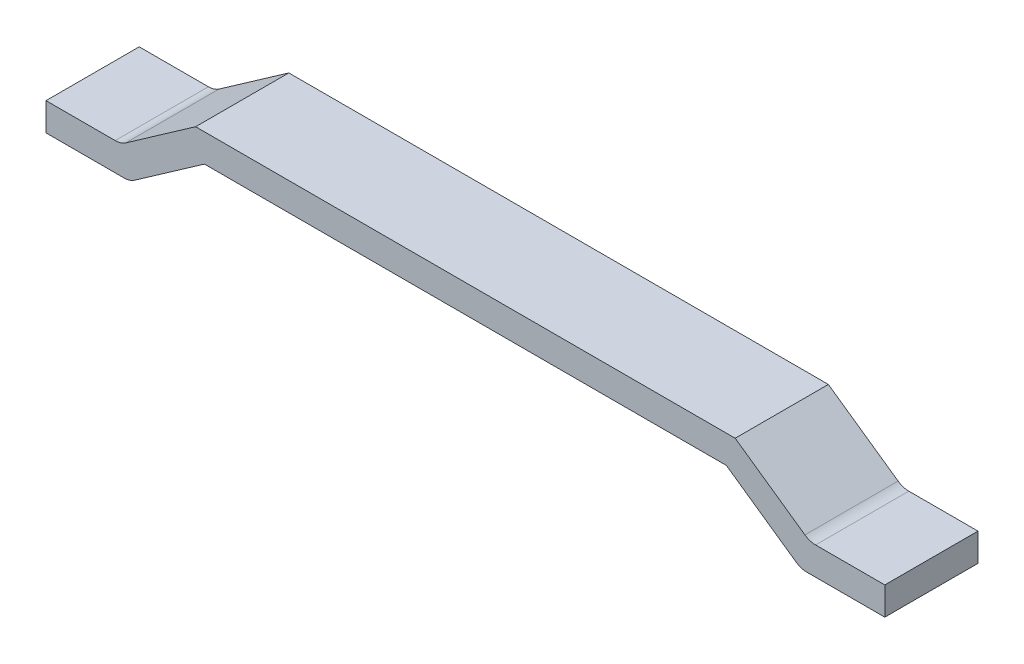
ISO-10303-21;
HEADER;
FILE_DESCRIPTION(('STEP AP214'),'2;1');
FILE_NAME('part.step','',(''),(''),'','','');
FILE_SCHEMA(('AUTOMOTIVE_DESIGN { 1 0 10303 214 1 1 1 1 }'));
ENDSEC;
DATA;
#1=APPLICATION_CONTEXT('core data for automotive mechanical design processes');
#2=APPLICATION_PROTOCOL_DEFINITION('international standard','automotive_design',2000,#1);
#3=PRODUCT_CONTEXT('',#1,'mechanical');
#4=PRODUCT('Part','Part','',(#3));
#5=PRODUCT_RELATED_PRODUCT_CATEGORY('part','',(#4));
#6=PRODUCT_DEFINITION_FORMATION('','',#4);
#7=PRODUCT_DEFINITION_CONTEXT('part definition',#1,'design');
#8=PRODUCT_DEFINITION('design','',#6,#7);
#9=PRODUCT_DEFINITION_SHAPE('','',#8);
#10=(LENGTH_UNIT() NAMED_UNIT(*) SI_UNIT(.MILLI.,.METRE.));
#11=(NAMED_UNIT(*) PLANE_ANGLE_UNIT() SI_UNIT($,.RADIAN.));
#12=(NAMED_UNIT(*) SI_UNIT($,.STERADIAN.) SOLID_ANGLE_UNIT());
#13=UNCERTAINTY_MEASURE_WITH_UNIT(LENGTH_MEASURE(1.E-05),#10,'distance_accuracy_value','');
#14=(GEOMETRIC_REPRESENTATION_CONTEXT(3) GLOBAL_UNCERTAINTY_ASSIGNED_CONTEXT((#13)) GLOBAL_UNIT_ASSIGNED_CONTEXT((#10,
#11,#12)) REPRESENTATION_CONTEXT('',''));
#15=CARTESIAN_POINT('',(0.,0.,0.));
#16=DIRECTION('',(0.,0.,1.));
#17=DIRECTION('',(1.,0.,0.));
#18=AXIS2_PLACEMENT_3D('',#15,#16,#17);
#19=CARTESIAN_POINT('',(-4.5,0.,-0.5));
#20=DIRECTION('',(0.,1.,0.));
#21=DIRECTION('',(0.,0.,1.));
#22=AXIS2_PLACEMENT_3D('',#19,#20,#21);
#23=PLANE('',#22);
#24=DIRECTION('',(1.,0.,0.));
#25=VECTOR('',#24,1.);
#26=CARTESIAN_POINT('',(-4.5,0.,0.5));
#27=LINE('',#26,#25);
#28=CARTESIAN_POINT('',(-3.663059757776,0.,0.5));
#29=VERTEX_POINT('',#28);
#30=CARTESIAN_POINT('',(-4.5,0.,0.5));
#31=VERTEX_POINT('',#30);
#32=EDGE_CURVE('E153',#29,#31,#27,.F.);
#33=ORIENTED_EDGE('',*,*,#32,.T.);
#34=DIRECTION('',(0.,0.,-1.));
#35=VECTOR('',#34,1.);
#36=CARTESIAN_POINT('',(-4.5,0.,-0.5));
#37=LINE('',#36,#35);
#38=CARTESIAN_POINT('',(-4.5,0.,-0.5));
#39=VERTEX_POINT('',#38);
#40=EDGE_CURVE('E227',#31,#39,#37,.T.);
#41=ORIENTED_EDGE('',*,*,#40,.T.);
#42=DIRECTION('',(1.,0.,0.));
#43=VECTOR('',#42,1.);
#44=CARTESIAN_POINT('',(-4.5,0.,-0.5));
#45=LINE('',#44,#43);
#46=CARTESIAN_POINT('',(-3.663059757776,0.,-0.5));
#47=VERTEX_POINT('',#46);
#48=EDGE_CURVE('E221',#47,#39,#45,.F.);
#49=ORIENTED_EDGE('',*,*,#48,.F.);
#50=DIRECTION('',(0.,0.,1.));
#51=VECTOR('',#50,1.);
#52=CARTESIAN_POINT('',(-3.663059757776,0.,-0.5));
#53=LINE('',#52,#51);
#54=EDGE_CURVE('E166',#29,#47,#53,.F.);
#55=ORIENTED_EDGE('',*,*,#54,.F.);
#56=EDGE_LOOP('',(#33,#41,#49,#55));
#57=FACE_BOUND('',#56,.T.);
#58=ADVANCED_FACE('F17',(#57),#23,.F.);
#59=CARTESIAN_POINT('',(-4.5,0.3,-0.5));
#60=DIRECTION('',(1.,0.,0.));
#61=DIRECTION('',(0.,0.,-1.));
#62=AXIS2_PLACEMENT_3D('',#59,#60,#61);
#63=PLANE('',#62);
#64=ORIENTED_EDGE('',*,*,#40,.F.);
#65=DIRECTION('',(0.,1.,0.));
#66=VECTOR('',#65,1.);
#67=CARTESIAN_POINT('',(-4.5,0.,0.5));
#68=LINE('',#67,#66);
#69=CARTESIAN_POINT('',(-4.5,0.3,0.5));
#70=VERTEX_POINT('',#69);
#71=EDGE_CURVE('E151',#31,#70,#68,.T.);
#72=ORIENTED_EDGE('',*,*,#71,.T.);
#73=DIRECTION('',(0.,0.,-1.));
#74=VECTOR('',#73,1.);
#75=CARTESIAN_POINT('',(-4.5,0.3,-0.5));
#76=LINE('',#75,#74);
#77=CARTESIAN_POINT('',(-4.5,0.3,-0.5));
#78=VERTEX_POINT('',#77);
#79=EDGE_CURVE('E136',#70,#78,#76,.T.);
#80=ORIENTED_EDGE('',*,*,#79,.T.);
#81=DIRECTION('',(0.,1.,0.));
#82=VECTOR('',#81,1.);
#83=CARTESIAN_POINT('',(-4.5,0.,-0.5));
#84=LINE('',#83,#82);
#85=EDGE_CURVE('E230',#39,#78,#84,.T.);
#86=ORIENTED_EDGE('',*,*,#85,.F.);
#87=EDGE_LOOP('',(#64,#72,#80,#86));
#88=FACE_BOUND('',#87,.T.);
#89=ADVANCED_FACE('F336',(#88),#63,.F.);
#90=CARTESIAN_POINT('',(-3.694589636664,0.3,-0.5));
#91=DIRECTION('',(0.,-1.,0.));
#92=DIRECTION('',(0.,0.,-1.));
#93=AXIS2_PLACEMENT_3D('',#90,#91,#92);
#94=PLANE('',#93);
#95=DIRECTION('',(1.,0.,0.));
#96=VECTOR('',#95,1.);
#97=CARTESIAN_POINT('',(-4.5,0.3,0.5));
#98=LINE('',#97,#96);
#99=CARTESIAN_POINT('',(-3.757649394439,0.3,0.5));
#100=VERTEX_POINT('',#99);
#101=EDGE_CURVE('E144',#70,#100,#98,.T.);
#102=ORIENTED_EDGE('',*,*,#101,.T.);
#103=DIRECTION('',(0.,0.,1.));
#104=VECTOR('',#103,1.);
#105=CARTESIAN_POINT('',(-3.757649394439,0.3,-0.5));
#106=LINE('',#105,#104);
#107=CARTESIAN_POINT('',(-3.757649394439,0.3,-0.5));
#108=VERTEX_POINT('',#107);
#109=EDGE_CURVE('E126',#100,#108,#106,.F.);
#110=ORIENTED_EDGE('',*,*,#109,.T.);
#111=DIRECTION('',(1.,0.,0.));
#112=VECTOR('',#111,1.);
#113=CARTESIAN_POINT('',(-4.5,0.3,-0.5));
#114=LINE('',#113,#112);
#115=EDGE_CURVE('E232',#78,#108,#114,.T.);
#116=ORIENTED_EDGE('',*,*,#115,.F.);
#117=ORIENTED_EDGE('',*,*,#79,.F.);
#118=EDGE_LOOP('',(#102,#110,#116,#117));
#119=FACE_BOUND('',#118,.T.);
#120=ADVANCED_FACE('F149',(#119),#94,.F.);
#121=CARTESIAN_POINT('',(-3.757649394439,0.5,-0.5));
#122=DIRECTION('',(0.,0.,1.));
#123=DIRECTION('',(0.,-1.,0.));
#124=AXIS2_PLACEMENT_3D('',#121,#122,#123);
#125=CYLINDRICAL_SURFACE('',#124,0.2);
#126=ORIENTED_EDGE('',*,*,#109,.F.);
#127=CARTESIAN_POINT('',(-3.757649394439,0.5,0.5));
#128=DIRECTION('',(0.,0.,1.));
#129=DIRECTION('',(0.,-1.,0.));
#130=AXIS2_PLACEMENT_3D('',#127,#128,#129);
#131=CIRCLE('',#130,0.2);
#132=CARTESIAN_POINT('',(-3.64293410716931,0.336169591142679,0.5));
#133=VERTEX_POINT('',#132);
#134=EDGE_CURVE('E20',#100,#133,#131,.T.);
#135=ORIENTED_EDGE('',*,*,#134,.T.);
#136=DIRECTION('',(0.,0.,1.));
#137=VECTOR('',#136,1.);
#138=CARTESIAN_POINT('',(-3.64293410716942,0.336169591142599,-0.5));
#139=LINE('',#138,#137);
#140=CARTESIAN_POINT('',(-3.64293410716903,0.336169591142425,-0.5));
#141=VERTEX_POINT('',#140);
#142=EDGE_CURVE('E219',#133,#141,#139,.F.);
#143=ORIENTED_EDGE('',*,*,#142,.T.);
#144=CARTESIAN_POINT('',(-3.757649394439,0.5,-0.5));
#145=DIRECTION('',(0.,0.,1.));
#146=DIRECTION('',(0.,-1.,0.));
#147=AXIS2_PLACEMENT_3D('',#144,#145,#146);
#148=CIRCLE('',#147,0.2);
#149=EDGE_CURVE('E131',#108,#141,#148,.T.);
#150=ORIENTED_EDGE('',*,*,#149,.F.);
#151=EDGE_LOOP('',(#126,#135,#143,#150));
#152=FACE_BOUND('',#151,.T.);
#153=ADVANCED_FACE('F128',(#152),#125,.F.);
#154=CARTESIAN_POINT('',(3.757649394439,0.5,-0.5));
#155=DIRECTION('',(0.,0.,1.));
#156=DIRECTION('',(0.,-1.,0.));
#157=AXIS2_PLACEMENT_3D('',#154,#155,#156);
#158=CYLINDRICAL_SURFACE('',#157,0.2);
#159=DIRECTION('',(0.,0.,1.));
#160=VECTOR('',#159,1.);
#161=CARTESIAN_POINT('',(3.64293410716929,0.336169591142409,-0.5));
#162=LINE('',#161,#160);
#163=CARTESIAN_POINT('',(3.64293410716896,0.33616959114233,-0.5));
#164=VERTEX_POINT('',#163);
#165=CARTESIAN_POINT('',(3.64293410716896,0.33616959114233,0.5));
#166=VERTEX_POINT('',#165);
#167=EDGE_CURVE('E163',#164,#166,#162,.T.);
#168=ORIENTED_EDGE('',*,*,#167,.T.);
#169=CARTESIAN_POINT('',(3.757649394439,0.5,0.5));
#170=DIRECTION('',(0.,0.,1.));
#171=DIRECTION('',(0.,-1.,0.));
#172=AXIS2_PLACEMENT_3D('',#169,#170,#171);
#173=CIRCLE('',#172,0.2);
#174=CARTESIAN_POINT('',(3.757649394439,0.3,0.5));
#175=VERTEX_POINT('',#174);
#176=EDGE_CURVE('E274',#166,#175,#173,.T.);
#177=ORIENTED_EDGE('',*,*,#176,.T.);
#178=DIRECTION('',(0.,0.,-1.));
#179=VECTOR('',#178,1.);
#180=CARTESIAN_POINT('',(3.757649394439,0.3,-0.5));
#181=LINE('',#180,#179);
#182=CARTESIAN_POINT('',(3.757649394439,0.3,-0.5));
#183=VERTEX_POINT('',#182);
#184=EDGE_CURVE('E135',#175,#183,#181,.T.);
#185=ORIENTED_EDGE('',*,*,#184,.T.);
#186=CARTESIAN_POINT('',(3.757649394439,0.5,-0.5));
#187=DIRECTION('',(0.,0.,1.));
#188=DIRECTION('',(0.,-1.,0.));
#189=AXIS2_PLACEMENT_3D('',#186,#187,#188);
#190=CIRCLE('',#189,0.2);
#191=EDGE_CURVE('E266',#164,#183,#190,.T.);
#192=ORIENTED_EDGE('',*,*,#191,.F.);
#193=EDGE_LOOP('',(#168,#177,#185,#192));
#194=FACE_BOUND('',#193,.T.);
#195=ADVANCED_FACE('F476',(#194),#158,.F.);
#196=CARTESIAN_POINT('',(4.5,0.3,-0.5));
#197=DIRECTION('',(0.,-1.,0.));
#198=DIRECTION('',(0.,0.,-1.));
#199=AXIS2_PLACEMENT_3D('',#196,#197,#198);
#200=PLANE('',#199);
#201=DIRECTION('',(1.,0.,0.));
#202=VECTOR('',#201,1.);
#203=CARTESIAN_POINT('',(-4.5,0.3,0.5));
#204=LINE('',#203,#202);
#205=CARTESIAN_POINT('',(4.5,0.3,0.5));
#206=VERTEX_POINT('',#205);
#207=EDGE_CURVE('E257',#175,#206,#204,.T.);
#208=ORIENTED_EDGE('',*,*,#207,.T.);
#209=DIRECTION('',(0.,0.,1.));
#210=VECTOR('',#209,1.);
#211=CARTESIAN_POINT('',(4.5,0.3,-0.5));
#212=LINE('',#211,#210);
#213=CARTESIAN_POINT('',(4.5,0.3,-0.5));
#214=VERTEX_POINT('',#213);
#215=EDGE_CURVE('E194',#206,#214,#212,.F.);
#216=ORIENTED_EDGE('',*,*,#215,.T.);
#217=DIRECTION('',(1.,0.,0.));
#218=VECTOR('',#217,1.);
#219=CARTESIAN_POINT('',(-4.5,0.3,-0.5));
#220=LINE('',#219,#218);
#221=EDGE_CURVE('E200',#183,#214,#220,.T.);
#222=ORIENTED_EDGE('',*,*,#221,.F.);
#223=ORIENTED_EDGE('',*,*,#184,.F.);
#224=EDGE_LOOP('',(#208,#216,#222,#223));
#225=FACE_BOUND('',#224,.T.);
#226=ADVANCED_FACE('F360',(#225),#200,.F.);
#227=CARTESIAN_POINT('',(4.5,0.,-0.5));
#228=DIRECTION('',(-1.,0.,0.));
#229=DIRECTION('',(0.,0.,1.));
#230=AXIS2_PLACEMENT_3D('',#227,#228,#229);
#231=PLANE('',#230);
#232=ORIENTED_EDGE('',*,*,#215,.F.);
#233=DIRECTION('',(0.,1.,0.));
#234=VECTOR('',#233,1.);
#235=CARTESIAN_POINT('',(4.5,0.,0.5));
#236=LINE('',#235,#234);
#237=CARTESIAN_POINT('',(4.5,0.,0.5));
#238=VERTEX_POINT('',#237);
#239=EDGE_CURVE('E253',#206,#238,#236,.F.);
#240=ORIENTED_EDGE('',*,*,#239,.T.);
#241=DIRECTION('',(0.,0.,1.));
#242=VECTOR('',#241,1.);
#243=CARTESIAN_POINT('',(4.5,0.,-0.5));
#244=LINE('',#243,#242);
#245=CARTESIAN_POINT('',(4.5,0.,-0.5));
#246=VERTEX_POINT('',#245);
#247=EDGE_CURVE('E191',#238,#246,#244,.F.);
#248=ORIENTED_EDGE('',*,*,#247,.T.);
#249=DIRECTION('',(0.,1.,0.));
#250=VECTOR('',#249,1.);
#251=CARTESIAN_POINT('',(4.5,0.,-0.5));
#252=LINE('',#251,#250);
#253=EDGE_CURVE('E197',#214,#246,#252,.F.);
#254=ORIENTED_EDGE('',*,*,#253,.F.);
#255=EDGE_LOOP('',(#232,#240,#248,#254));
#256=FACE_BOUND('',#255,.T.);
#257=ADVANCED_FACE('F356',(#256),#231,.F.);
#258=CARTESIAN_POINT('',(3.6,0.,-0.5));
#259=DIRECTION('',(0.,1.,0.));
#260=DIRECTION('',(0.,0.,1.));
#261=AXIS2_PLACEMENT_3D('',#258,#259,#260);
#262=PLANE('',#261);
#263=DIRECTION('',(1.,0.,0.));
#264=VECTOR('',#263,1.);
#265=CARTESIAN_POINT('',(-4.5,0.,0.5));
#266=LINE('',#265,#264);
#267=CARTESIAN_POINT('',(3.663059757776,0.,0.5));
#268=VERTEX_POINT('',#267);
#269=EDGE_CURVE('E256',#238,#268,#266,.F.);
#270=ORIENTED_EDGE('',*,*,#269,.T.);
#271=DIRECTION('',(0.,0.,1.));
#272=VECTOR('',#271,1.);
#273=CARTESIAN_POINT('',(3.663059757776,0.,-0.5));
#274=LINE('',#273,#272);
#275=CARTESIAN_POINT('',(3.663059757776,0.,-0.5));
#276=VERTEX_POINT('',#275);
#277=EDGE_CURVE('E189',#276,#268,#274,.T.);
#278=ORIENTED_EDGE('',*,*,#277,.F.);
#279=DIRECTION('',(1.,0.,0.));
#280=VECTOR('',#279,1.);
#281=CARTESIAN_POINT('',(-4.5,0.,-0.5));
#282=LINE('',#281,#280);
#283=EDGE_CURVE('E199',#246,#276,#282,.F.);
#284=ORIENTED_EDGE('',*,*,#283,.F.);
#285=ORIENTED_EDGE('',*,*,#247,.F.);
#286=EDGE_LOOP('',(#270,#278,#284,#285));
#287=FACE_BOUND('',#286,.T.);
#288=ADVANCED_FACE('F352',(#287),#262,.F.);
#289=CARTESIAN_POINT('',(3.663059757776,0.2,-0.5));
#290=DIRECTION('',(0.,0.,1.));
#291=DIRECTION('',(0.,-1.,0.));
#292=AXIS2_PLACEMENT_3D('',#289,#290,#291);
#293=CYLINDRICAL_SURFACE('',#292,0.2);
#294=CARTESIAN_POINT('',(3.663059757776,0.2,0.5));
#295=DIRECTION('',(0.,0.,1.));
#296=DIRECTION('',(0.,-1.,0.));
#297=AXIS2_PLACEMENT_3D('',#294,#295,#296);
#298=CIRCLE('',#297,0.2);
#299=CARTESIAN_POINT('',(3.54834447050593,0.0361695911422456,0.5));
#300=VERTEX_POINT('',#299);
#301=EDGE_CURVE('E272',#268,#300,#298,.F.);
#302=ORIENTED_EDGE('',*,*,#301,.T.);
#303=DIRECTION('',(0.,0.,1.));
#304=VECTOR('',#303,1.);
#305=CARTESIAN_POINT('',(3.548344470506,0.0361695911421947,-0.5));
#306=LINE('',#305,#304);
#307=CARTESIAN_POINT('',(3.54834447050593,0.0361695911422455,-0.5));
#308=VERTEX_POINT('',#307);
#309=EDGE_CURVE('E184',#300,#308,#306,.F.);
#310=ORIENTED_EDGE('',*,*,#309,.T.);
#311=CARTESIAN_POINT('',(3.663059757776,0.2,-0.5));
#312=DIRECTION('',(0.,0.,1.));
#313=DIRECTION('',(0.,-1.,0.));
#314=AXIS2_PLACEMENT_3D('',#311,#312,#313);
#315=CIRCLE('',#314,0.2);
#316=EDGE_CURVE('E264',#276,#308,#315,.F.);
#317=ORIENTED_EDGE('',*,*,#316,.F.);
#318=ORIENTED_EDGE('',*,*,#277,.T.);
#319=EDGE_LOOP('',(#302,#310,#317,#318));
#320=FACE_BOUND('',#319,.T.);
#321=ADVANCED_FACE('F347',(#320),#293,.T.);
#322=CARTESIAN_POINT('',(2.8,0.560166030568,-0.5));
#323=DIRECTION('',(0.573576436351011,0.819152044289016,0.));
#324=DIRECTION('',(-0.819152044289016,0.573576436351011,0.));
#325=AXIS2_PLACEMENT_3D('',#322,#323,#324);
#326=PLANE('',#325);
#327=DIRECTION('',(-0.81915204428902,0.573576436351006,0.));
#328=VECTOR('',#327,1.);
#329=CARTESIAN_POINT('',(3.548344470506,0.0361695911422,0.5));
#330=LINE('',#329,#328);
#331=CARTESIAN_POINT('',(2.8,0.560166030568,0.5));
#332=VERTEX_POINT('',#331);
#333=EDGE_CURVE('E250',#300,#332,#330,.T.);
#334=ORIENTED_EDGE('',*,*,#333,.T.);
#335=DIRECTION('',(0.,0.,1.));
#336=VECTOR('',#335,1.);
#337=CARTESIAN_POINT('',(2.8,0.560166030568,-0.5));
#338=LINE('',#337,#336);
#339=CARTESIAN_POINT('',(2.8,0.560166030568,-0.5));
#340=VERTEX_POINT('',#339);
#341=EDGE_CURVE('E173',#332,#340,#338,.F.);
#342=ORIENTED_EDGE('',*,*,#341,.T.);
#343=DIRECTION('',(-0.81915204428902,0.573576436351006,0.));
#344=VECTOR('',#343,1.);
#345=CARTESIAN_POINT('',(3.548344470506,0.0361695911422,-0.5));
#346=LINE('',#345,#344);
#347=EDGE_CURVE('E179',#308,#340,#346,.T.);
#348=ORIENTED_EDGE('',*,*,#347,.F.);
#349=ORIENTED_EDGE('',*,*,#309,.F.);
#350=EDGE_LOOP('',(#334,#342,#348,#349));
#351=FACE_BOUND('',#350,.T.);
#352=ADVANCED_FACE('F343',(#351),#326,.F.);
#353=CARTESIAN_POINT('',(-2.8,0.560166030568,-0.5));
#354=DIRECTION('',(0.,1.,0.));
#355=DIRECTION('',(0.,0.,1.));
#356=AXIS2_PLACEMENT_3D('',#353,#354,#355);
#357=PLANE('',#356);
#358=ORIENTED_EDGE('',*,*,#341,.F.);
#359=DIRECTION('',(1.,0.,0.));
#360=VECTOR('',#359,1.);
#361=CARTESIAN_POINT('',(-4.5,0.560166030568,0.5));
#362=LINE('',#361,#360);
#363=CARTESIAN_POINT('',(-2.79999999999993,0.560166030567937,0.5));
#364=VERTEX_POINT('',#363);
#365=EDGE_CURVE('E246',#332,#364,#362,.F.);
#366=ORIENTED_EDGE('',*,*,#365,.T.);
#367=DIRECTION('',(0.,0.,1.));
#368=VECTOR('',#367,1.);
#369=CARTESIAN_POINT('',(-2.79999999999987,0.56016603056781,-0.5));
#370=LINE('',#369,#368);
#371=CARTESIAN_POINT('',(-2.79999999999996,0.560166030567937,-0.5));
#372=VERTEX_POINT('',#371);
#373=EDGE_CURVE('E170',#364,#372,#370,.F.);
#374=ORIENTED_EDGE('',*,*,#373,.T.);
#375=DIRECTION('',(1.,0.,0.));
#376=VECTOR('',#375,1.);
#377=CARTESIAN_POINT('',(-4.5,0.560166030568,-0.5));
#378=LINE('',#377,#376);
#379=EDGE_CURVE('E176',#340,#372,#378,.F.);
#380=ORIENTED_EDGE('',*,*,#379,.F.);
#381=EDGE_LOOP('',(#358,#366,#374,#380));
#382=FACE_BOUND('',#381,.T.);
#383=ADVANCED_FACE('F340',(#382),#357,.F.);
#384=CARTESIAN_POINT('',(-3.6,0.,-0.5));
#385=DIRECTION('',(-0.573576436351011,0.819152044289016,0.));
#386=DIRECTION('',(-0.819152044289016,-0.573576436351011,0.));
#387=AXIS2_PLACEMENT_3D('',#384,#385,#386);
#388=PLANE('',#387);
#389=DIRECTION('',(-0.81915204428902,-0.573576436351006,0.));
#390=VECTOR('',#389,1.);
#391=CARTESIAN_POINT('',(-2.8,0.560166030568,0.5));
#392=LINE('',#391,#390);
#393=CARTESIAN_POINT('',(-3.5483444705059,0.0361695911421981,0.5));
#394=VERTEX_POINT('',#393);
#395=EDGE_CURVE('E249',#364,#394,#392,.T.);
#396=ORIENTED_EDGE('',*,*,#395,.T.);
#397=DIRECTION('',(0.,0.,1.));
#398=VECTOR('',#397,1.);
#399=CARTESIAN_POINT('',(-3.54834447050593,0.0361695911421025,-0.5));
#400=LINE('',#399,#398);
#401=CARTESIAN_POINT('',(-3.5483444705059,0.036169591142198,-0.5));
#402=VERTEX_POINT('',#401);
#403=EDGE_CURVE('E168',#402,#394,#400,.T.);
#404=ORIENTED_EDGE('',*,*,#403,.F.);
#405=DIRECTION('',(-0.81915204428902,-0.573576436351006,0.));
#406=VECTOR('',#405,1.);
#407=CARTESIAN_POINT('',(-2.8,0.560166030568,-0.5));
#408=LINE('',#407,#406);
#409=EDGE_CURVE('E178',#372,#402,#408,.T.);
#410=ORIENTED_EDGE('',*,*,#409,.F.);
#411=ORIENTED_EDGE('',*,*,#373,.F.);
#412=EDGE_LOOP('',(#396,#404,#410,#411));
#413=FACE_BOUND('',#412,.T.);
#414=ADVANCED_FACE('F328',(#413),#388,.F.);
#415=CARTESIAN_POINT('',(-3.663059757776,0.2,-0.5));
#416=DIRECTION('',(0.,0.,1.));
#417=DIRECTION('',(0.,-1.,0.));
#418=AXIS2_PLACEMENT_3D('',#415,#416,#417);
#419=CYLINDRICAL_SURFACE('',#418,0.2);
#420=CARTESIAN_POINT('',(-3.663059757776,0.2,0.5));
#421=DIRECTION('',(0.,0.,1.));
#422=DIRECTION('',(0.,-1.,0.));
#423=AXIS2_PLACEMENT_3D('',#420,#421,#422);
#424=CIRCLE('',#423,0.2);
#425=EDGE_CURVE('E240',#394,#29,#424,.F.);
#426=ORIENTED_EDGE('',*,*,#425,.T.);
#427=ORIENTED_EDGE('',*,*,#54,.T.);
#428=CARTESIAN_POINT('',(-3.663059757776,0.2,-0.5));
#429=DIRECTION('',(0.,0.,1.));
#430=DIRECTION('',(0.,-1.,0.));
#431=AXIS2_PLACEMENT_3D('',#428,#429,#430);
#432=CIRCLE('',#431,0.2);
#433=EDGE_CURVE('E214',#402,#47,#432,.F.);
#434=ORIENTED_EDGE('',*,*,#433,.F.);
#435=ORIENTED_EDGE('',*,*,#403,.T.);
#436=EDGE_LOOP('',(#426,#427,#434,#435));
#437=FACE_BOUND('',#436,.T.);
#438=ADVANCED_FACE('F331',(#437),#419,.T.);
#439=CARTESIAN_POINT('',(3.694589636664,0.3,-0.5));
#440=DIRECTION('',(-0.573576436351011,-0.819152044289016,0.));
#441=DIRECTION('',(0.819152044289016,-0.573576436351011,0.));
#442=AXIS2_PLACEMENT_3D('',#439,#440,#441);
#443=PLANE('',#442);
#444=DIRECTION('',(0.819152044288557,-0.573576436351667,0.));
#445=VECTOR('',#444,1.);
#446=CARTESIAN_POINT('',(2.894589636664,0.860166030568,0.5));
#447=LINE('',#446,#445);
#448=CARTESIAN_POINT('',(2.89458963666398,0.860166030568,0.5));
#449=VERTEX_POINT('',#448);
#450=EDGE_CURVE('E148',#449,#166,#447,.T.);
#451=ORIENTED_EDGE('',*,*,#450,.T.);
#452=ORIENTED_EDGE('',*,*,#167,.F.);
#453=DIRECTION('',(0.819152044288557,-0.573576436351667,0.));
#454=VECTOR('',#453,1.);
#455=CARTESIAN_POINT('',(2.894589636664,0.860166030568,-0.5));
#456=LINE('',#455,#454);
#457=CARTESIAN_POINT('',(2.89458963666401,0.860166030567998,-0.5));
#458=VERTEX_POINT('',#457);
#459=EDGE_CURVE('E268',#458,#164,#456,.T.);
#460=ORIENTED_EDGE('',*,*,#459,.F.);
#461=DIRECTION('',(0.,0.,-1.));
#462=VECTOR('',#461,1.);
#463=CARTESIAN_POINT('',(2.894589636664,0.860166030568,-0.5));
#464=LINE('',#463,#462);
#465=EDGE_CURVE('E210',#458,#449,#464,.F.);
#466=ORIENTED_EDGE('',*,*,#465,.T.);
#467=EDGE_LOOP('',(#451,#452,#460,#466));
#468=FACE_BOUND('',#467,.T.);
#469=ADVANCED_FACE('F367',(#468),#443,.F.);
#470=CARTESIAN_POINT('',(-4.5,0.,0.5));
#471=DIRECTION('',(0.,0.,-1.));
#472=DIRECTION('',(0.,1.,0.));
#473=AXIS2_PLACEMENT_3D('',#470,#471,#472);
#474=PLANE('',#473);
#475=ORIENTED_EDGE('',*,*,#395,.F.);
#476=ORIENTED_EDGE('',*,*,#365,.F.);
#477=ORIENTED_EDGE('',*,*,#333,.F.);
#478=ORIENTED_EDGE('',*,*,#301,.F.);
#479=ORIENTED_EDGE('',*,*,#269,.F.);
#480=ORIENTED_EDGE('',*,*,#239,.F.);
#481=ORIENTED_EDGE('',*,*,#207,.F.);
#482=ORIENTED_EDGE('',*,*,#176,.F.);
#483=ORIENTED_EDGE('',*,*,#450,.F.);
#484=DIRECTION('',(1.,0.,0.));
#485=VECTOR('',#484,1.);
#486=CARTESIAN_POINT('',(2.894589636664,0.860166030568,0.5));
#487=LINE('',#486,#485);
#488=CARTESIAN_POINT('',(-2.894589636664,0.860166030568,0.5));
#489=VERTEX_POINT('',#488);
#490=EDGE_CURVE('E213',#449,#489,#487,.F.);
#491=ORIENTED_EDGE('',*,*,#490,.T.);
#492=DIRECTION('',(0.819152044289016,0.573576436351011,0.));
#493=VECTOR('',#492,1.);
#494=CARTESIAN_POINT('',(-2.894589636664,0.860166030568,0.5));
#495=LINE('',#494,#493);
#496=EDGE_CURVE('E147',#489,#133,#495,.F.);
#497=ORIENTED_EDGE('',*,*,#496,.T.);
#498=ORIENTED_EDGE('',*,*,#134,.F.);
#499=ORIENTED_EDGE('',*,*,#101,.F.);
#500=ORIENTED_EDGE('',*,*,#71,.F.);
#501=ORIENTED_EDGE('',*,*,#32,.F.);
#502=ORIENTED_EDGE('',*,*,#425,.F.);
#503=EDGE_LOOP('',(#475,#476,#477,#478,#479,#480,#481,#482,#483,#491,#497,#498,#499,#500,#501,#502));
#504=FACE_BOUND('',#503,.T.);
#505=ADVANCED_FACE('F142',(#504),#474,.F.);
#506=CARTESIAN_POINT('',(-2.894589636664,0.860166030568,-0.5));
#507=DIRECTION('',(0.573576436351011,-0.819152044289016,0.));
#508=DIRECTION('',(0.819152044289016,0.573576436351011,0.));
#509=AXIS2_PLACEMENT_3D('',#506,#507,#508);
#510=PLANE('',#509);
#511=ORIENTED_EDGE('',*,*,#496,.F.);
#512=DIRECTION('',(0.,0.,-1.));
#513=VECTOR('',#512,1.);
#514=CARTESIAN_POINT('',(-2.894589636664,0.860166030568,-0.5));
#515=LINE('',#514,#513);
#516=CARTESIAN_POINT('',(-2.894589636664,0.860166030568,-0.5));
#517=VERTEX_POINT('',#516);
#518=EDGE_CURVE('E26',#489,#517,#515,.T.);
#519=ORIENTED_EDGE('',*,*,#518,.T.);
#520=DIRECTION('',(0.819152044288557,0.573576436351667,0.));
#521=VECTOR('',#520,1.);
#522=CARTESIAN_POINT('',(-3.642934107169,0.336169591142,-0.5));
#523=LINE('',#522,#521);
#524=EDGE_CURVE('E34',#141,#517,#523,.T.);
#525=ORIENTED_EDGE('',*,*,#524,.F.);
#526=ORIENTED_EDGE('',*,*,#142,.F.);
#527=EDGE_LOOP('',(#511,#519,#525,#526));
#528=FACE_BOUND('',#527,.T.);
#529=ADVANCED_FACE('F370',(#528),#510,.F.);
#530=CARTESIAN_POINT('',(-4.5,0.,-0.5));
#531=DIRECTION('',(0.,0.,-1.));
#532=DIRECTION('',(0.,1.,0.));
#533=AXIS2_PLACEMENT_3D('',#530,#531,#532);
#534=PLANE('',#533);
#535=ORIENTED_EDGE('',*,*,#409,.T.);
#536=ORIENTED_EDGE('',*,*,#433,.T.);
#537=ORIENTED_EDGE('',*,*,#48,.T.);
#538=ORIENTED_EDGE('',*,*,#85,.T.);
#539=ORIENTED_EDGE('',*,*,#115,.T.);
#540=ORIENTED_EDGE('',*,*,#149,.T.);
#541=ORIENTED_EDGE('',*,*,#524,.T.);
#542=DIRECTION('',(1.,0.,0.));
#543=VECTOR('',#542,1.);
#544=CARTESIAN_POINT('',(2.894589636664,0.860166030568,-0.5));
#545=LINE('',#544,#543);
#546=EDGE_CURVE('E11',#517,#458,#545,.T.);
#547=ORIENTED_EDGE('',*,*,#546,.T.);
#548=ORIENTED_EDGE('',*,*,#459,.T.);
#549=ORIENTED_EDGE('',*,*,#191,.T.);
#550=ORIENTED_EDGE('',*,*,#221,.T.);
#551=ORIENTED_EDGE('',*,*,#253,.T.);
#552=ORIENTED_EDGE('',*,*,#283,.T.);
#553=ORIENTED_EDGE('',*,*,#316,.T.);
#554=ORIENTED_EDGE('',*,*,#347,.T.);
#555=ORIENTED_EDGE('',*,*,#379,.T.);
#556=EDGE_LOOP('',(#535,#536,#537,#538,#539,#540,#541,#547,#548,#549,#550,#551,#552,#553,#554,#555));
#557=FACE_BOUND('',#556,.T.);
#558=ADVANCED_FACE('F323',(#557),#534,.T.);
#559=CARTESIAN_POINT('',(2.894589636664,0.860166030568,-0.5));
#560=DIRECTION('',(0.,-1.,0.));
#561=DIRECTION('',(0.,0.,-1.));
#562=AXIS2_PLACEMENT_3D('',#559,#560,#561);
#563=PLANE('',#562);
#564=ORIENTED_EDGE('',*,*,#518,.F.);
#565=ORIENTED_EDGE('',*,*,#490,.F.);
#566=ORIENTED_EDGE('',*,*,#465,.F.);
#567=ORIENTED_EDGE('',*,*,#546,.F.);
#568=EDGE_LOOP('',(#564,#565,#566,#567));
#569=FACE_BOUND('',#568,.T.);
#570=ADVANCED_FACE('F365',(#569),#563,.F.);
#571=CLOSED_SHELL('',(#58,#89,#120,#153,#195,#226,#257,#288,#321,#352,#383,#414,#438,#469,#505,
#529,#558,#570));
#572=MANIFOLD_SOLID_BREP('B1',#571);
#573=ADVANCED_BREP_SHAPE_REPRESENTATION('',(#18,#572),#14);
#574=SHAPE_DEFINITION_REPRESENTATION(#9,#573);
ENDSEC;
END-ISO-10303-21;
